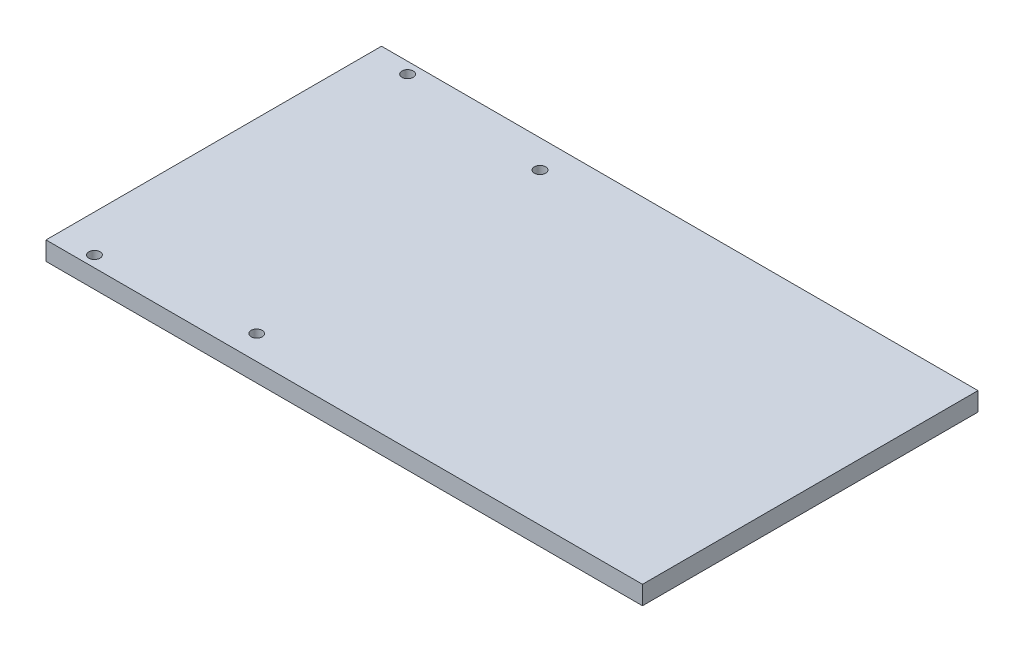
ISO-10303-21;
HEADER;
FILE_DESCRIPTION(('STEP AP214'),'2;1');
FILE_NAME('part.step','',(''),(''),'','','');
FILE_SCHEMA(('AUTOMOTIVE_DESIGN { 1 0 10303 214 1 1 1 1 }'));
ENDSEC;
DATA;
#1=APPLICATION_CONTEXT('core data for automotive mechanical design processes');
#2=APPLICATION_PROTOCOL_DEFINITION('international standard','automotive_design',2000,#1);
#3=PRODUCT_CONTEXT('',#1,'mechanical');
#4=PRODUCT('Part','Part','',(#3));
#5=PRODUCT_RELATED_PRODUCT_CATEGORY('part','',(#4));
#6=PRODUCT_DEFINITION_FORMATION('','',#4);
#7=PRODUCT_DEFINITION_CONTEXT('part definition',#1,'design');
#8=PRODUCT_DEFINITION('design','',#6,#7);
#9=PRODUCT_DEFINITION_SHAPE('','',#8);
#10=(LENGTH_UNIT() NAMED_UNIT(*) SI_UNIT(.MILLI.,.METRE.));
#11=(NAMED_UNIT(*) PLANE_ANGLE_UNIT() SI_UNIT($,.RADIAN.));
#12=(NAMED_UNIT(*) SI_UNIT($,.STERADIAN.) SOLID_ANGLE_UNIT());
#13=UNCERTAINTY_MEASURE_WITH_UNIT(LENGTH_MEASURE(1.E-05),#10,'distance_accuracy_value','');
#14=(GEOMETRIC_REPRESENTATION_CONTEXT(3) GLOBAL_UNCERTAINTY_ASSIGNED_CONTEXT((#13)) GLOBAL_UNIT_ASSIGNED_CONTEXT((#10,
#11,#12)) REPRESENTATION_CONTEXT('',''));
#15=CARTESIAN_POINT('',(0.,0.,0.));
#16=DIRECTION('',(0.,0.,1.));
#17=DIRECTION('',(1.,0.,0.));
#18=AXIS2_PLACEMENT_3D('',#15,#16,#17);
#19=CARTESIAN_POINT('',(0.,5.,0.));
#20=DIRECTION('',(0.,1.,0.));
#21=DIRECTION('',(0.,0.,1.));
#22=AXIS2_PLACEMENT_3D('',#19,#20,#21);
#23=PLANE('',#22);
#24=CARTESIAN_POINT('',(-46.0066916740195,5.,13.857845429811));
#25=DIRECTION('',(0.,1.,0.));
#26=DIRECTION('',(0.,0.,1.));
#27=AXIS2_PLACEMENT_3D('',#24,#25,#26);
#28=CIRCLE('',#27,1.5);
#29=CARTESIAN_POINT('',(-46.0066916740195,5.,15.357845429811));
#30=VERTEX_POINT('',#29);
#31=EDGE_CURVE('E106',#30,#30,#28,.T.);
#32=ORIENTED_EDGE('',*,*,#31,.F.);
#33=EDGE_LOOP('',(#32));
#34=FACE_BOUND('',#33,.T.);
#35=CARTESIAN_POINT('',(-46.0066916740194,5.,89.857845429811));
#36=DIRECTION('',(0.,1.,0.));
#37=DIRECTION('',(0.,0.,1.));
#38=AXIS2_PLACEMENT_3D('',#35,#36,#37);
#39=CIRCLE('',#38,1.5);
#40=CARTESIAN_POINT('',(-46.0066916740194,5.,91.357845429811));
#41=VERTEX_POINT('',#40);
#42=EDGE_CURVE('E109',#41,#41,#39,.T.);
#43=ORIENTED_EDGE('',*,*,#42,.F.);
#44=EDGE_LOOP('',(#43));
#45=FACE_BOUND('',#44,.T.);
#46=DIRECTION('',(1.,0.,0.));
#47=VECTOR('',#46,1.);
#48=CARTESIAN_POINT('',(-96.0206552803245,5.,96.357845429811));
#49=LINE('',#48,#47);
#50=CARTESIAN_POINT('',(-96.0206552803245,5.,96.357845429811));
#51=VERTEX_POINT('',#50);
#52=CARTESIAN_POINT('',(63.9793447196755,5.,96.357845429811));
#53=VERTEX_POINT('',#52);
#54=EDGE_CURVE('E85',#51,#53,#49,.T.);
#55=ORIENTED_EDGE('',*,*,#54,.T.);
#56=DIRECTION('',(0.,0.,1.));
#57=VECTOR('',#56,1.);
#58=CARTESIAN_POINT('',(63.9793447196755,5.,6.35784542981103));
#59=LINE('',#58,#57);
#60=CARTESIAN_POINT('',(63.9793447196755,5.,6.35784542981103));
#61=VERTEX_POINT('',#60);
#62=EDGE_CURVE('E88',#61,#53,#59,.T.);
#63=ORIENTED_EDGE('',*,*,#62,.F.);
#64=DIRECTION('',(-1.,0.,0.));
#65=VECTOR('',#64,1.);
#66=CARTESIAN_POINT('',(-96.0206552803245,5.,6.35784542981103));
#67=LINE('',#66,#65);
#68=CARTESIAN_POINT('',(-96.0206552803245,5.,6.35784542981103));
#69=VERTEX_POINT('',#68);
#70=EDGE_CURVE('E54',#61,#69,#67,.T.);
#71=ORIENTED_EDGE('',*,*,#70,.T.);
#72=DIRECTION('',(0.,0.,1.));
#73=VECTOR('',#72,1.);
#74=CARTESIAN_POINT('',(-96.0206552803245,5.,6.35784542981103));
#75=LINE('',#74,#73);
#76=EDGE_CURVE('E126',#69,#51,#75,.T.);
#77=ORIENTED_EDGE('',*,*,#76,.T.);
#78=EDGE_LOOP('',(#55,#63,#71,#77));
#79=FACE_BOUND('',#78,.T.);
#80=CARTESIAN_POINT('',(-86.0206552803245,5.,9.35784542981103));
#81=DIRECTION('',(0.,1.,0.));
#82=DIRECTION('',(0.,0.,1.));
#83=AXIS2_PLACEMENT_3D('',#80,#81,#82);
#84=CIRCLE('',#83,1.5);
#85=CARTESIAN_POINT('',(-86.0206552803245,5.,10.857845429811));
#86=VERTEX_POINT('',#85);
#87=EDGE_CURVE('E120',#86,#86,#84,.T.);
#88=ORIENTED_EDGE('',*,*,#87,.F.);
#89=EDGE_LOOP('',(#88));
#90=FACE_BOUND('',#89,.T.);
#91=CARTESIAN_POINT('',(-86.0206552803245,5.,93.357845429811));
#92=DIRECTION('',(0.,1.,0.));
#93=DIRECTION('',(0.,0.,1.));
#94=AXIS2_PLACEMENT_3D('',#91,#92,#93);
#95=CIRCLE('',#94,1.5);
#96=CARTESIAN_POINT('',(-86.0206552803245,5.,94.857845429811));
#97=VERTEX_POINT('',#96);
#98=EDGE_CURVE('E114',#97,#97,#95,.T.);
#99=ORIENTED_EDGE('',*,*,#98,.F.);
#100=EDGE_LOOP('',(#99));
#101=FACE_BOUND('',#100,.T.);
#102=ADVANCED_FACE('F37',(#34,#45,#79,#90,#101),#23,.T.);
#103=CARTESIAN_POINT('',(0.,0.,0.));
#104=DIRECTION('',(0.,1.,0.));
#105=DIRECTION('',(0.,0.,1.));
#106=AXIS2_PLACEMENT_3D('',#103,#104,#105);
#107=PLANE('',#106);
#108=CARTESIAN_POINT('',(-46.0066916740195,0.,13.857845429811));
#109=DIRECTION('',(0.,1.,0.));
#110=DIRECTION('',(0.,0.,1.));
#111=AXIS2_PLACEMENT_3D('',#108,#109,#110);
#112=CIRCLE('',#111,1.5);
#113=CARTESIAN_POINT('',(-46.0066916740195,0.,15.357845429811));
#114=VERTEX_POINT('',#113);
#115=EDGE_CURVE('E102',#114,#114,#112,.T.);
#116=ORIENTED_EDGE('',*,*,#115,.T.);
#117=EDGE_LOOP('',(#116));
#118=FACE_BOUND('',#117,.T.);
#119=CARTESIAN_POINT('',(-46.0066916740194,0.,89.857845429811));
#120=DIRECTION('',(0.,1.,0.));
#121=DIRECTION('',(0.,0.,1.));
#122=AXIS2_PLACEMENT_3D('',#119,#120,#121);
#123=CIRCLE('',#122,1.5);
#124=CARTESIAN_POINT('',(-46.0066916740194,0.,91.357845429811));
#125=VERTEX_POINT('',#124);
#126=EDGE_CURVE('E101',#125,#125,#123,.T.);
#127=ORIENTED_EDGE('',*,*,#126,.T.);
#128=EDGE_LOOP('',(#127));
#129=FACE_BOUND('',#128,.T.);
#130=DIRECTION('',(-1.,0.,0.));
#131=VECTOR('',#130,1.);
#132=CARTESIAN_POINT('',(-96.0206552803245,0.,6.35784542981103));
#133=LINE('',#132,#131);
#134=CARTESIAN_POINT('',(63.9793447196755,0.,6.35784542981103));
#135=VERTEX_POINT('',#134);
#136=CARTESIAN_POINT('',(-96.0206552803245,0.,6.35784542981103));
#137=VERTEX_POINT('',#136);
#138=EDGE_CURVE('E70',#135,#137,#133,.T.);
#139=ORIENTED_EDGE('',*,*,#138,.F.);
#140=DIRECTION('',(0.,0.,-1.));
#141=VECTOR('',#140,1.);
#142=CARTESIAN_POINT('',(63.9793447196755,0.,96.357845429811));
#143=LINE('',#142,#141);
#144=CARTESIAN_POINT('',(63.9793447196755,0.,96.357845429811));
#145=VERTEX_POINT('',#144);
#146=EDGE_CURVE('E96',#145,#135,#143,.T.);
#147=ORIENTED_EDGE('',*,*,#146,.F.);
#148=DIRECTION('',(1.,0.,0.));
#149=VECTOR('',#148,1.);
#150=CARTESIAN_POINT('',(-96.0206552803245,0.,96.357845429811));
#151=LINE('',#150,#149);
#152=CARTESIAN_POINT('',(-96.0206552803245,0.,96.357845429811));
#153=VERTEX_POINT('',#152);
#154=EDGE_CURVE('E66',#153,#145,#151,.T.);
#155=ORIENTED_EDGE('',*,*,#154,.F.);
#156=DIRECTION('',(0.,0.,1.));
#157=VECTOR('',#156,1.);
#158=CARTESIAN_POINT('',(-96.0206552803245,0.,6.35784542981103));
#159=LINE('',#158,#157);
#160=EDGE_CURVE('E123',#137,#153,#159,.T.);
#161=ORIENTED_EDGE('',*,*,#160,.F.);
#162=EDGE_LOOP('',(#139,#147,#155,#161));
#163=FACE_BOUND('',#162,.T.);
#164=CARTESIAN_POINT('',(-86.0206552803245,0.,9.35784542981103));
#165=DIRECTION('',(0.,1.,0.));
#166=DIRECTION('',(0.,0.,1.));
#167=AXIS2_PLACEMENT_3D('',#164,#165,#166);
#168=CIRCLE('',#167,1.5);
#169=CARTESIAN_POINT('',(-86.0206552803245,0.,10.857845429811));
#170=VERTEX_POINT('',#169);
#171=EDGE_CURVE('E117',#170,#170,#168,.T.);
#172=ORIENTED_EDGE('',*,*,#171,.T.);
#173=EDGE_LOOP('',(#172));
#174=FACE_BOUND('',#173,.T.);
#175=CARTESIAN_POINT('',(-86.0206552803245,0.,93.357845429811));
#176=DIRECTION('',(0.,1.,0.));
#177=DIRECTION('',(0.,0.,1.));
#178=AXIS2_PLACEMENT_3D('',#175,#176,#177);
#179=CIRCLE('',#178,1.5);
#180=CARTESIAN_POINT('',(-86.0206552803245,0.,94.857845429811));
#181=VERTEX_POINT('',#180);
#182=EDGE_CURVE('E105',#181,#181,#179,.T.);
#183=ORIENTED_EDGE('',*,*,#182,.T.);
#184=EDGE_LOOP('',(#183));
#185=FACE_BOUND('',#184,.T.);
#186=ADVANCED_FACE('F134',(#118,#129,#163,#174,#185),#107,.F.);
#187=CARTESIAN_POINT('',(-96.0206552803245,5.,6.35784542981103));
#188=DIRECTION('',(1.,0.,0.));
#189=DIRECTION('',(0.,0.,-1.));
#190=AXIS2_PLACEMENT_3D('',#187,#188,#189);
#191=PLANE('',#190);
#192=ORIENTED_EDGE('',*,*,#160,.T.);
#193=DIRECTION('',(0.,-1.,0.));
#194=VECTOR('',#193,1.);
#195=CARTESIAN_POINT('',(-96.0206552803245,5.,96.357845429811));
#196=LINE('',#195,#194);
#197=EDGE_CURVE('E11',#51,#153,#196,.T.);
#198=ORIENTED_EDGE('',*,*,#197,.F.);
#199=ORIENTED_EDGE('',*,*,#76,.F.);
#200=DIRECTION('',(0.,-1.,0.));
#201=VECTOR('',#200,1.);
#202=CARTESIAN_POINT('',(-96.0206552803245,5.,6.35784542981103));
#203=LINE('',#202,#201);
#204=EDGE_CURVE('E46',#69,#137,#203,.T.);
#205=ORIENTED_EDGE('',*,*,#204,.T.);
#206=EDGE_LOOP('',(#192,#198,#199,#205));
#207=FACE_BOUND('',#206,.T.);
#208=ADVANCED_FACE('F39',(#207),#191,.F.);
#209=CARTESIAN_POINT('',(-96.0206552803245,5.,96.357845429811));
#210=DIRECTION('',(0.,0.,-1.));
#211=DIRECTION('',(-1.,0.,0.));
#212=AXIS2_PLACEMENT_3D('',#209,#210,#211);
#213=PLANE('',#212);
#214=ORIENTED_EDGE('',*,*,#154,.T.);
#215=DIRECTION('',(0.,-1.,0.));
#216=VECTOR('',#215,1.);
#217=CARTESIAN_POINT('',(63.9793447196755,5.,96.357845429811));
#218=LINE('',#217,#216);
#219=EDGE_CURVE('E93',#53,#145,#218,.T.);
#220=ORIENTED_EDGE('',*,*,#219,.F.);
#221=ORIENTED_EDGE('',*,*,#54,.F.);
#222=ORIENTED_EDGE('',*,*,#197,.T.);
#223=EDGE_LOOP('',(#214,#220,#221,#222));
#224=FACE_BOUND('',#223,.T.);
#225=ADVANCED_FACE('F167',(#224),#213,.F.);
#226=CARTESIAN_POINT('',(-96.0206552803245,5.,6.35784542981103));
#227=DIRECTION('',(0.,0.,1.));
#228=DIRECTION('',(1.,0.,0.));
#229=AXIS2_PLACEMENT_3D('',#226,#227,#228);
#230=PLANE('',#229);
#231=ORIENTED_EDGE('',*,*,#70,.F.);
#232=DIRECTION('',(0.,1.,0.));
#233=VECTOR('',#232,1.);
#234=CARTESIAN_POINT('',(63.9793447196755,0.,6.35784542981103));
#235=LINE('',#234,#233);
#236=EDGE_CURVE('E82',#135,#61,#235,.T.);
#237=ORIENTED_EDGE('',*,*,#236,.F.);
#238=ORIENTED_EDGE('',*,*,#138,.T.);
#239=ORIENTED_EDGE('',*,*,#204,.F.);
#240=EDGE_LOOP('',(#231,#237,#238,#239));
#241=FACE_BOUND('',#240,.T.);
#242=ADVANCED_FACE('F80',(#241),#230,.F.);
#243=CARTESIAN_POINT('',(-86.0206552803245,5.,9.35784542981103));
#244=DIRECTION('',(0.,-1.,0.));
#245=DIRECTION('',(0.,0.,-1.));
#246=AXIS2_PLACEMENT_3D('',#243,#244,#245);
#247=CYLINDRICAL_SURFACE('',#246,1.5);
#248=ORIENTED_EDGE('',*,*,#87,.T.);
#249=EDGE_LOOP('',(#248));
#250=FACE_BOUND('',#249,.T.);
#251=ORIENTED_EDGE('',*,*,#171,.F.);
#252=EDGE_LOOP('',(#251));
#253=FACE_BOUND('',#252,.T.);
#254=ADVANCED_FACE('F146',(#250,#253),#247,.F.);
#255=CARTESIAN_POINT('',(-86.0206552803245,5.,93.357845429811));
#256=DIRECTION('',(0.,-1.,0.));
#257=DIRECTION('',(0.,0.,-1.));
#258=AXIS2_PLACEMENT_3D('',#255,#256,#257);
#259=CYLINDRICAL_SURFACE('',#258,1.5);
#260=ORIENTED_EDGE('',*,*,#98,.T.);
#261=EDGE_LOOP('',(#260));
#262=FACE_BOUND('',#261,.T.);
#263=ORIENTED_EDGE('',*,*,#182,.F.);
#264=EDGE_LOOP('',(#263));
#265=FACE_BOUND('',#264,.T.);
#266=ADVANCED_FACE('F143',(#262,#265),#259,.F.);
#267=CARTESIAN_POINT('',(-46.0066916740194,0.,89.857845429811));
#268=DIRECTION('',(0.,1.,0.));
#269=DIRECTION('',(0.,0.,1.));
#270=AXIS2_PLACEMENT_3D('',#267,#268,#269);
#271=CYLINDRICAL_SURFACE('',#270,1.5);
#272=ORIENTED_EDGE('',*,*,#126,.F.);
#273=EDGE_LOOP('',(#272));
#274=FACE_BOUND('',#273,.T.);
#275=ORIENTED_EDGE('',*,*,#42,.T.);
#276=EDGE_LOOP('',(#275));
#277=FACE_BOUND('',#276,.T.);
#278=ADVANCED_FACE('F145',(#274,#277),#271,.F.);
#279=CARTESIAN_POINT('',(-46.0066916740195,0.,13.857845429811));
#280=DIRECTION('',(0.,1.,0.));
#281=DIRECTION('',(0.,0.,1.));
#282=AXIS2_PLACEMENT_3D('',#279,#280,#281);
#283=CYLINDRICAL_SURFACE('',#282,1.5);
#284=ORIENTED_EDGE('',*,*,#115,.F.);
#285=EDGE_LOOP('',(#284));
#286=FACE_BOUND('',#285,.T.);
#287=ORIENTED_EDGE('',*,*,#31,.T.);
#288=EDGE_LOOP('',(#287));
#289=FACE_BOUND('',#288,.T.);
#290=ADVANCED_FACE('F154',(#286,#289),#283,.F.);
#291=CARTESIAN_POINT('',(63.9793447196755,0.,0.));
#292=DIRECTION('',(1.,0.,0.));
#293=DIRECTION('',(0.,0.,-1.));
#294=AXIS2_PLACEMENT_3D('',#291,#292,#293);
#295=PLANE('',#294);
#296=ORIENTED_EDGE('',*,*,#236,.T.);
#297=ORIENTED_EDGE('',*,*,#62,.T.);
#298=ORIENTED_EDGE('',*,*,#219,.T.);
#299=ORIENTED_EDGE('',*,*,#146,.T.);
#300=EDGE_LOOP('',(#296,#297,#298,#299));
#301=FACE_BOUND('',#300,.T.);
#302=ADVANCED_FACE('F95',(#301),#295,.T.);
#303=CLOSED_SHELL('',(#102,#186,#208,#225,#242,#254,#266,#278,#290,#302));
#304=MANIFOLD_SOLID_BREP('B2',#303);
#305=ADVANCED_BREP_SHAPE_REPRESENTATION('',(#18,#304),#14);
#306=SHAPE_DEFINITION_REPRESENTATION(#9,#305);
ENDSEC;
END-ISO-10303-21;
